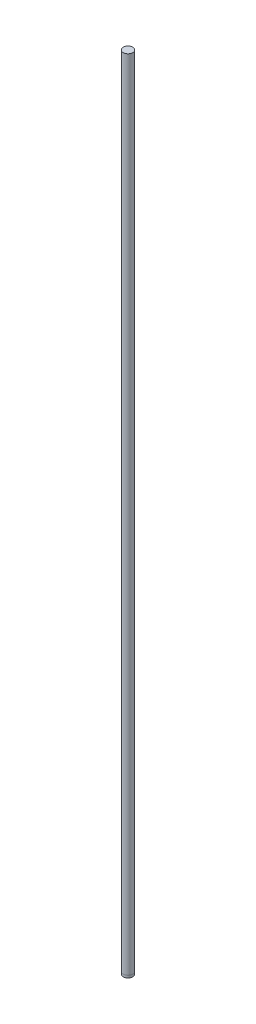
ISO-10303-21;
HEADER;
FILE_DESCRIPTION(('STEP AP214'),'2;1');
FILE_NAME('part.step','',(''),(''),'','','');
FILE_SCHEMA(('AUTOMOTIVE_DESIGN { 1 0 10303 214 1 1 1 1 }'));
ENDSEC;
DATA;
#1=APPLICATION_CONTEXT('core data for automotive mechanical design processes');
#2=APPLICATION_PROTOCOL_DEFINITION('international standard','automotive_design',2000,#1);
#3=PRODUCT_CONTEXT('',#1,'mechanical');
#4=PRODUCT('Part','Part','',(#3));
#5=PRODUCT_RELATED_PRODUCT_CATEGORY('part','',(#4));
#6=PRODUCT_DEFINITION_FORMATION('','',#4);
#7=PRODUCT_DEFINITION_CONTEXT('part definition',#1,'design');
#8=PRODUCT_DEFINITION('design','',#6,#7);
#9=PRODUCT_DEFINITION_SHAPE('','',#8);
#10=(LENGTH_UNIT() NAMED_UNIT(*) SI_UNIT(.MILLI.,.METRE.));
#11=(NAMED_UNIT(*) PLANE_ANGLE_UNIT() SI_UNIT($,.RADIAN.));
#12=(NAMED_UNIT(*) SI_UNIT($,.STERADIAN.) SOLID_ANGLE_UNIT());
#13=UNCERTAINTY_MEASURE_WITH_UNIT(LENGTH_MEASURE(1.E-05),#10,'distance_accuracy_value','');
#14=(GEOMETRIC_REPRESENTATION_CONTEXT(3) GLOBAL_UNCERTAINTY_ASSIGNED_CONTEXT((#13)) GLOBAL_UNIT_ASSIGNED_CONTEXT((#10,
#11,#12)) REPRESENTATION_CONTEXT('',''));
#15=CARTESIAN_POINT('',(0.,0.,0.));
#16=DIRECTION('',(0.,0.,1.));
#17=DIRECTION('',(1.,0.,0.));
#18=AXIS2_PLACEMENT_3D('',#15,#16,#17);
#19=CARTESIAN_POINT('',(0.,1000.,0.));
#20=DIRECTION('',(0.,-1.,0.));
#21=DIRECTION('',(0.,0.,-1.));
#22=AXIS2_PLACEMENT_3D('',#19,#20,#21);
#23=CYLINDRICAL_SURFACE('',#22,6.);
#24=CARTESIAN_POINT('',(0.,1000.,0.));
#25=DIRECTION('',(0.,1.,0.));
#26=DIRECTION('',(0.,0.,1.));
#27=AXIS2_PLACEMENT_3D('',#24,#25,#26);
#28=CIRCLE('',#27,6.);
#29=CARTESIAN_POINT('',(0.,1000.,6.));
#30=VERTEX_POINT('',#29);
#31=EDGE_CURVE('E46',#30,#30,#28,.T.);
#32=ORIENTED_EDGE('',*,*,#31,.F.);
#33=EDGE_LOOP('',(#32));
#34=FACE_BOUND('',#33,.T.);
#35=CARTESIAN_POINT('',(0.,-3.,0.));
#36=DIRECTION('',(0.,-1.,0.));
#37=DIRECTION('',(0.,0.,-1.));
#38=AXIS2_PLACEMENT_3D('',#35,#36,#37);
#39=CIRCLE('',#38,6.);
#40=CARTESIAN_POINT('',(0.,-3.,-6.));
#41=VERTEX_POINT('',#40);
#42=EDGE_CURVE('E56',#41,#41,#39,.T.);
#43=ORIENTED_EDGE('',*,*,#42,.F.);
#44=EDGE_LOOP('',(#43));
#45=FACE_BOUND('',#44,.T.);
#46=ADVANCED_FACE('F43',(#34,#45),#23,.T.);
#47=CARTESIAN_POINT('',(0.,1000.,0.));
#48=DIRECTION('',(0.,1.,0.));
#49=DIRECTION('',(0.,0.,1.));
#50=AXIS2_PLACEMENT_3D('',#47,#48,#49);
#51=PLANE('',#50);
#52=ORIENTED_EDGE('',*,*,#31,.T.);
#53=EDGE_LOOP('',(#52));
#54=FACE_BOUND('',#53,.T.);
#55=ADVANCED_FACE('F78',(#54),#51,.T.);
#56=CARTESIAN_POINT('',(0.,-3.,0.));
#57=DIRECTION('',(0.,-1.,0.));
#58=DIRECTION('',(0.,0.,-1.));
#59=AXIS2_PLACEMENT_3D('',#56,#57,#58);
#60=PLANE('',#59);
#61=CARTESIAN_POINT('',(0.,-3.,0.));
#62=DIRECTION('',(0.,-1.,0.));
#63=DIRECTION('',(0.,0.,-1.));
#64=AXIS2_PLACEMENT_3D('',#61,#62,#63);
#65=CIRCLE('',#64,5.97077483722115);
#66=CARTESIAN_POINT('',(0.,-3.,-5.97077483722115));
#67=VERTEX_POINT('',#66);
#68=EDGE_CURVE('E10',#67,#67,#65,.T.);
#69=ORIENTED_EDGE('',*,*,#68,.F.);
#70=EDGE_LOOP('',(#69));
#71=FACE_BOUND('',#70,.T.);
#72=ORIENTED_EDGE('',*,*,#42,.T.);
#73=EDGE_LOOP('',(#72));
#74=FACE_BOUND('',#73,.T.);
#75=ADVANCED_FACE('F71',(#71,#74),#60,.T.);
#76=CARTESIAN_POINT('',(0.,-6.,0.));
#77=DIRECTION('',(0.,1.,0.));
#78=DIRECTION('',(0.,0.,1.));
#79=AXIS2_PLACEMENT_3D('',#76,#77,#78);
#80=CYLINDRICAL_SURFACE('',#79,5.97077483722115);
#81=CARTESIAN_POINT('',(0.,-6.,0.));
#82=DIRECTION('',(0.,-1.,0.));
#83=DIRECTION('',(0.,0.,-1.));
#84=AXIS2_PLACEMENT_3D('',#81,#82,#83);
#85=CIRCLE('',#84,5.97077483722115);
#86=CARTESIAN_POINT('',(0.,-6.,-5.97077483722115));
#87=VERTEX_POINT('',#86);
#88=EDGE_CURVE('E58',#87,#87,#85,.T.);
#89=ORIENTED_EDGE('',*,*,#88,.F.);
#90=EDGE_LOOP('',(#89));
#91=FACE_BOUND('',#90,.T.);
#92=ORIENTED_EDGE('',*,*,#68,.T.);
#93=EDGE_LOOP('',(#92));
#94=FACE_BOUND('',#93,.T.);
#95=ADVANCED_FACE('F69',(#91,#94),#80,.T.);
#96=CARTESIAN_POINT('',(0.,-6.,0.));
#97=DIRECTION('',(0.,-1.,0.));
#98=DIRECTION('',(0.,0.,-1.));
#99=AXIS2_PLACEMENT_3D('',#96,#97,#98);
#100=PLANE('',#99);
#101=ORIENTED_EDGE('',*,*,#88,.T.);
#102=EDGE_LOOP('',(#101));
#103=FACE_BOUND('',#102,.T.);
#104=ADVANCED_FACE('F67',(#103),#100,.T.);
#105=CLOSED_SHELL('',(#46,#55,#75,#95,#104));
#106=MANIFOLD_SOLID_BREP('B2',#105);
#107=ADVANCED_BREP_SHAPE_REPRESENTATION('',(#18,#106),#14);
#108=SHAPE_DEFINITION_REPRESENTATION(#9,#107);
ENDSEC;
END-ISO-10303-21;
